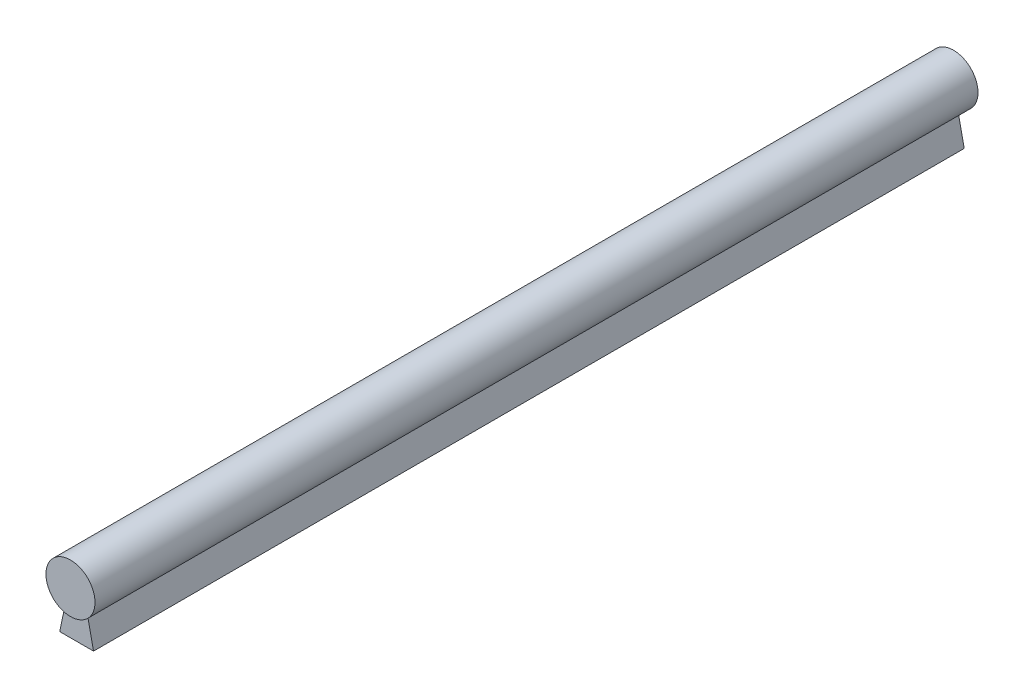
ISO-10303-21;
HEADER;
FILE_DESCRIPTION(('STEP AP214'),'2;1');
FILE_NAME('part.step','',(''),(''),'','','');
FILE_SCHEMA(('AUTOMOTIVE_DESIGN { 1 0 10303 214 1 1 1 1 }'));
ENDSEC;
DATA;
#1=APPLICATION_CONTEXT('core data for automotive mechanical design processes');
#2=APPLICATION_PROTOCOL_DEFINITION('international standard','automotive_design',2000,#1);
#3=PRODUCT_CONTEXT('',#1,'mechanical');
#4=PRODUCT('Part','Part','',(#3));
#5=PRODUCT_RELATED_PRODUCT_CATEGORY('part','',(#4));
#6=PRODUCT_DEFINITION_FORMATION('','',#4);
#7=PRODUCT_DEFINITION_CONTEXT('part definition',#1,'design');
#8=PRODUCT_DEFINITION('design','',#6,#7);
#9=PRODUCT_DEFINITION_SHAPE('','',#8);
#10=(LENGTH_UNIT() NAMED_UNIT(*) SI_UNIT(.MILLI.,.METRE.));
#11=(NAMED_UNIT(*) PLANE_ANGLE_UNIT() SI_UNIT($,.RADIAN.));
#12=(NAMED_UNIT(*) SI_UNIT($,.STERADIAN.) SOLID_ANGLE_UNIT());
#13=UNCERTAINTY_MEASURE_WITH_UNIT(LENGTH_MEASURE(1.E-05),#10,'distance_accuracy_value','');
#14=(GEOMETRIC_REPRESENTATION_CONTEXT(3) GLOBAL_UNCERTAINTY_ASSIGNED_CONTEXT((#13)) GLOBAL_UNIT_ASSIGNED_CONTEXT((#10,
#11,#12)) REPRESENTATION_CONTEXT('',''));
#15=CARTESIAN_POINT('',(0.,0.,0.));
#16=DIRECTION('',(0.,0.,1.));
#17=DIRECTION('',(1.,0.,0.));
#18=AXIS2_PLACEMENT_3D('',#15,#16,#17);
#19=CARTESIAN_POINT('',(0.,0.,457.2));
#20=DIRECTION('',(0.,0.,-1.));
#21=DIRECTION('',(-1.,0.,0.));
#22=AXIS2_PLACEMENT_3D('',#19,#20,#21);
#23=CYLINDRICAL_SURFACE('',#22,12.7);
#24=DIRECTION('',(0.,0.,-1.));
#25=VECTOR('',#24,1.);
#26=CARTESIAN_POINT('',(-5.76895260041466,-11.3141144547052,454.025));
#27=LINE('',#26,#25);
#28=CARTESIAN_POINT('',(-5.76895260041466,-11.3141144547052,454.025));
#29=VERTEX_POINT('',#28);
#30=CARTESIAN_POINT('',(-5.76895260041466,-11.3141144547052,3.17499999999998));
#31=VERTEX_POINT('',#30);
#32=EDGE_CURVE('E53',#29,#31,#27,.T.);
#33=ORIENTED_EDGE('',*,*,#32,.F.);
#34=CARTESIAN_POINT('',(0.,0.,454.025));
#35=DIRECTION('',(0.,0.,1.));
#36=DIRECTION('',(1.,0.,0.));
#37=AXIS2_PLACEMENT_3D('',#34,#35,#36);
#38=CIRCLE('',#37,12.7);
#39=CARTESIAN_POINT('',(5.76895260041466,-11.3141144547052,454.025));
#40=VERTEX_POINT('',#39);
#41=EDGE_CURVE('E48',#29,#40,#38,.T.);
#42=ORIENTED_EDGE('',*,*,#41,.T.);
#43=DIRECTION('',(0.,0.,-1.));
#44=VECTOR('',#43,1.);
#45=CARTESIAN_POINT('',(5.76895260041466,-11.3141144547052,454.025));
#46=LINE('',#45,#44);
#47=CARTESIAN_POINT('',(5.76895260041466,-11.3141144547052,3.175));
#48=VERTEX_POINT('',#47);
#49=EDGE_CURVE('E107',#40,#48,#46,.T.);
#50=ORIENTED_EDGE('',*,*,#49,.T.);
#51=CARTESIAN_POINT('',(0.,0.,3.175));
#52=DIRECTION('',(0.,0.,1.));
#53=DIRECTION('',(1.,0.,0.));
#54=AXIS2_PLACEMENT_3D('',#51,#52,#53);
#55=CIRCLE('',#54,12.7);
#56=EDGE_CURVE('E99',#31,#48,#55,.T.);
#57=ORIENTED_EDGE('',*,*,#56,.F.);
#58=EDGE_LOOP('',(#33,#42,#50,#57));
#59=FACE_BOUND('',#58,.T.);
#60=CARTESIAN_POINT('',(0.,0.,457.2));
#61=DIRECTION('',(0.,0.,1.));
#62=DIRECTION('',(1.,0.,0.));
#63=AXIS2_PLACEMENT_3D('',#60,#61,#62);
#64=CIRCLE('',#63,12.7);
#65=CARTESIAN_POINT('',(12.7,0.,457.2));
#66=VERTEX_POINT('',#65);
#67=EDGE_CURVE('E11',#66,#66,#64,.T.);
#68=ORIENTED_EDGE('',*,*,#67,.F.);
#69=EDGE_LOOP('',(#68));
#70=FACE_BOUND('',#69,.T.);
#71=CARTESIAN_POINT('',(0.,0.,0.));
#72=DIRECTION('',(0.,0.,1.));
#73=DIRECTION('',(1.,0.,0.));
#74=AXIS2_PLACEMENT_3D('',#71,#72,#73);
#75=CIRCLE('',#74,12.7);
#76=CARTESIAN_POINT('',(12.7,0.,0.));
#77=VERTEX_POINT('',#76);
#78=EDGE_CURVE('E37',#77,#77,#75,.T.);
#79=ORIENTED_EDGE('',*,*,#78,.T.);
#80=EDGE_LOOP('',(#79));
#81=FACE_BOUND('',#80,.T.);
#82=ADVANCED_FACE('F34',(#59,#70,#81),#23,.T.);
#83=CARTESIAN_POINT('',(0.,0.,457.2));
#84=DIRECTION('',(0.,0.,1.));
#85=DIRECTION('',(1.,0.,0.));
#86=AXIS2_PLACEMENT_3D('',#83,#84,#85);
#87=PLANE('',#86);
#88=ORIENTED_EDGE('',*,*,#67,.T.);
#89=EDGE_LOOP('',(#88));
#90=FACE_BOUND('',#89,.T.);
#91=ADVANCED_FACE('F116',(#90),#87,.T.);
#92=CARTESIAN_POINT('',(0.,0.,0.));
#93=DIRECTION('',(0.,0.,1.));
#94=DIRECTION('',(1.,0.,0.));
#95=AXIS2_PLACEMENT_3D('',#92,#93,#94);
#96=PLANE('',#95);
#97=ORIENTED_EDGE('',*,*,#78,.F.);
#98=EDGE_LOOP('',(#97));
#99=FACE_BOUND('',#98,.T.);
#100=ADVANCED_FACE('F113',(#99),#96,.F.);
#101=CARTESIAN_POINT('',(8.763,-25.4,454.025));
#102=DIRECTION('',(-0.978147600733805,-0.20791169081776,0.));
#103=DIRECTION('',(0.20791169081776,-0.978147600733806,0.));
#104=AXIS2_PLACEMENT_3D('',#101,#102,#103);
#105=PLANE('',#104);
#106=DIRECTION('',(-0.20791169081776,0.978147600733806,0.));
#107=VECTOR('',#106,1.);
#108=CARTESIAN_POINT('',(8.763,-25.4,3.175));
#109=LINE('',#108,#107);
#110=CARTESIAN_POINT('',(8.763,-25.4,3.175));
#111=VERTEX_POINT('',#110);
#112=EDGE_CURVE('E96',#111,#48,#109,.T.);
#113=ORIENTED_EDGE('',*,*,#112,.T.);
#114=ORIENTED_EDGE('',*,*,#49,.F.);
#115=DIRECTION('',(-0.20791169081776,0.978147600733806,0.));
#116=VECTOR('',#115,1.);
#117=CARTESIAN_POINT('',(8.763,-25.4,454.025));
#118=LINE('',#117,#116);
#119=CARTESIAN_POINT('',(8.763,-25.4,454.025));
#120=VERTEX_POINT('',#119);
#121=EDGE_CURVE('E92',#120,#40,#118,.T.);
#122=ORIENTED_EDGE('',*,*,#121,.F.);
#123=DIRECTION('',(0.,0.,-1.));
#124=VECTOR('',#123,1.);
#125=CARTESIAN_POINT('',(8.763,-25.4,454.025));
#126=LINE('',#125,#124);
#127=EDGE_CURVE('E81',#120,#111,#126,.T.);
#128=ORIENTED_EDGE('',*,*,#127,.T.);
#129=EDGE_LOOP('',(#113,#114,#122,#128));
#130=FACE_BOUND('',#129,.T.);
#131=ADVANCED_FACE('F115',(#130),#105,.F.);
#132=CARTESIAN_POINT('',(-8.763,-25.4,454.025));
#133=DIRECTION('',(-0.978147600733806,0.20791169081776,0.));
#134=DIRECTION('',(-0.20791169081776,-0.978147600733806,0.));
#135=AXIS2_PLACEMENT_3D('',#132,#133,#134);
#136=PLANE('',#135);
#137=DIRECTION('',(0.20791169081776,0.978147600733806,0.));
#138=VECTOR('',#137,1.);
#139=CARTESIAN_POINT('',(-8.763,-25.4,3.175));
#140=LINE('',#139,#138);
#141=CARTESIAN_POINT('',(-8.763,-25.4,3.175));
#142=VERTEX_POINT('',#141);
#143=EDGE_CURVE('E78',#142,#31,#140,.T.);
#144=ORIENTED_EDGE('',*,*,#143,.F.);
#145=DIRECTION('',(0.,0.,-1.));
#146=VECTOR('',#145,1.);
#147=CARTESIAN_POINT('',(-8.763,-25.4,454.025));
#148=LINE('',#147,#146);
#149=CARTESIAN_POINT('',(-8.763,-25.4,454.025));
#150=VERTEX_POINT('',#149);
#151=EDGE_CURVE('E72',#150,#142,#148,.T.);
#152=ORIENTED_EDGE('',*,*,#151,.F.);
#153=DIRECTION('',(0.20791169081776,0.978147600733806,0.));
#154=VECTOR('',#153,1.);
#155=CARTESIAN_POINT('',(-8.763,-25.4,454.025));
#156=LINE('',#155,#154);
#157=EDGE_CURVE('E76',#150,#29,#156,.T.);
#158=ORIENTED_EDGE('',*,*,#157,.T.);
#159=ORIENTED_EDGE('',*,*,#32,.T.);
#160=EDGE_LOOP('',(#144,#152,#158,#159));
#161=FACE_BOUND('',#160,.T.);
#162=ADVANCED_FACE('F74',(#161),#136,.T.);
#163=CARTESIAN_POINT('',(-8.763,-25.4,454.025));
#164=DIRECTION('',(0.,1.,0.));
#165=DIRECTION('',(-1.,0.,0.));
#166=AXIS2_PLACEMENT_3D('',#163,#164,#165);
#167=PLANE('',#166);
#168=DIRECTION('',(1.,0.,0.));
#169=VECTOR('',#168,1.);
#170=CARTESIAN_POINT('',(-8.763,-25.4,3.175));
#171=LINE('',#170,#169);
#172=EDGE_CURVE('E103',#142,#111,#171,.T.);
#173=ORIENTED_EDGE('',*,*,#172,.T.);
#174=ORIENTED_EDGE('',*,*,#127,.F.);
#175=DIRECTION('',(1.,0.,0.));
#176=VECTOR('',#175,1.);
#177=CARTESIAN_POINT('',(-8.763,-25.4,454.025));
#178=LINE('',#177,#176);
#179=EDGE_CURVE('E84',#150,#120,#178,.T.);
#180=ORIENTED_EDGE('',*,*,#179,.F.);
#181=ORIENTED_EDGE('',*,*,#151,.T.);
#182=EDGE_LOOP('',(#173,#174,#180,#181));
#183=FACE_BOUND('',#182,.T.);
#184=ADVANCED_FACE('F85',(#183),#167,.F.);
#185=CARTESIAN_POINT('',(0.,0.,454.025));
#186=DIRECTION('',(0.,0.,1.));
#187=DIRECTION('',(1.,0.,0.));
#188=AXIS2_PLACEMENT_3D('',#185,#186,#187);
#189=PLANE('',#188);
#190=ORIENTED_EDGE('',*,*,#121,.T.);
#191=ORIENTED_EDGE('',*,*,#41,.F.);
#192=ORIENTED_EDGE('',*,*,#157,.F.);
#193=ORIENTED_EDGE('',*,*,#179,.T.);
#194=EDGE_LOOP('',(#190,#191,#192,#193));
#195=FACE_BOUND('',#194,.T.);
#196=ADVANCED_FACE('F90',(#195),#189,.T.);
#197=CARTESIAN_POINT('',(0.,0.,3.175));
#198=DIRECTION('',(0.,0.,1.));
#199=DIRECTION('',(1.,0.,0.));
#200=AXIS2_PLACEMENT_3D('',#197,#198,#199);
#201=PLANE('',#200);
#202=ORIENTED_EDGE('',*,*,#112,.F.);
#203=ORIENTED_EDGE('',*,*,#172,.F.);
#204=ORIENTED_EDGE('',*,*,#143,.T.);
#205=ORIENTED_EDGE('',*,*,#56,.T.);
#206=EDGE_LOOP('',(#202,#203,#204,#205));
#207=FACE_BOUND('',#206,.T.);
#208=ADVANCED_FACE('F167',(#207),#201,.F.);
#209=CLOSED_SHELL('',(#82,#91,#100,#131,#162,#184,#196,#208));
#210=MANIFOLD_SOLID_BREP('B2',#209);
#211=ADVANCED_BREP_SHAPE_REPRESENTATION('',(#18,#210),#14);
#212=SHAPE_DEFINITION_REPRESENTATION(#9,#211);
ENDSEC;
END-ISO-10303-21;
